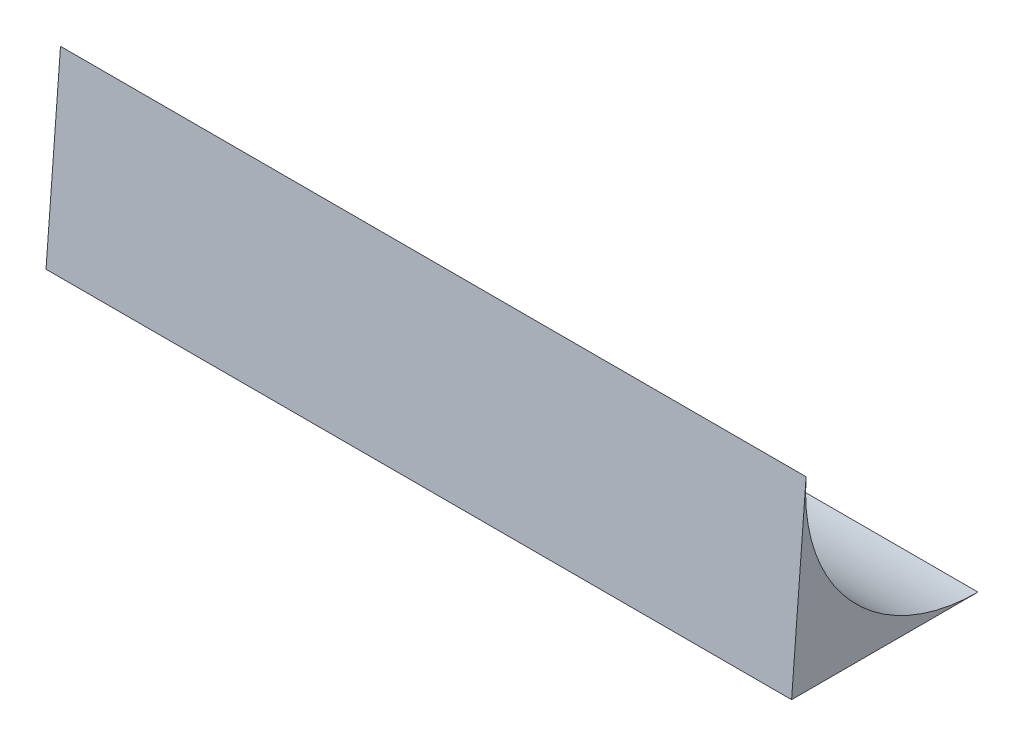
ISO-10303-21;
HEADER;
FILE_DESCRIPTION(('STEP AP214'),'2;1');
FILE_NAME('part.step','',(''),(''),'','','');
FILE_SCHEMA(('AUTOMOTIVE_DESIGN { 1 0 10303 214 1 1 1 1 }'));
ENDSEC;
DATA;
#1=APPLICATION_CONTEXT('core data for automotive mechanical design processes');
#2=APPLICATION_PROTOCOL_DEFINITION('international standard','automotive_design',2000,#1);
#3=PRODUCT_CONTEXT('',#1,'mechanical');
#4=PRODUCT('Part','Part','',(#3));
#5=PRODUCT_RELATED_PRODUCT_CATEGORY('part','',(#4));
#6=PRODUCT_DEFINITION_FORMATION('','',#4);
#7=PRODUCT_DEFINITION_CONTEXT('part definition',#1,'design');
#8=PRODUCT_DEFINITION('design','',#6,#7);
#9=PRODUCT_DEFINITION_SHAPE('','',#8);
#10=(LENGTH_UNIT() NAMED_UNIT(*) SI_UNIT(.MILLI.,.METRE.));
#11=(NAMED_UNIT(*) PLANE_ANGLE_UNIT() SI_UNIT($,.RADIAN.));
#12=(NAMED_UNIT(*) SI_UNIT($,.STERADIAN.) SOLID_ANGLE_UNIT());
#13=UNCERTAINTY_MEASURE_WITH_UNIT(LENGTH_MEASURE(1.E-05),#10,'distance_accuracy_value','');
#14=(GEOMETRIC_REPRESENTATION_CONTEXT(3) GLOBAL_UNCERTAINTY_ASSIGNED_CONTEXT((#13)) GLOBAL_UNIT_ASSIGNED_CONTEXT((#10,
#11,#12)) REPRESENTATION_CONTEXT('',''));
#15=CARTESIAN_POINT('',(0.,0.,0.));
#16=DIRECTION('',(0.,0.,1.));
#17=DIRECTION('',(1.,0.,0.));
#18=AXIS2_PLACEMENT_3D('',#15,#16,#17);
#19=CARTESIAN_POINT('',(40.,0.,0.));
#20=DIRECTION('',(0.,-0.0778039744021554,-0.996968676321994));
#21=DIRECTION('',(0.,0.996968676321994,-0.0778039744021554));
#22=AXIS2_PLACEMENT_3D('',#19,#20,#21);
#23=PLANE('',#22);
#24=DIRECTION('',(0.,-0.996968676321994,0.0778039744021554));
#25=VECTOR('',#24,1.);
#26=CARTESIAN_POINT('',(0.,0.,0.));
#27=LINE('',#26,#25);
#28=CARTESIAN_POINT('',(0.,9.96968676321994,-0.778039744021556));
#29=VERTEX_POINT('',#28);
#30=CARTESIAN_POINT('',(0.,0.,0.));
#31=VERTEX_POINT('',#30);
#32=EDGE_CURVE('E82',#29,#31,#27,.T.);
#33=ORIENTED_EDGE('',*,*,#32,.T.);
#34=DIRECTION('',(-1.,0.,0.));
#35=VECTOR('',#34,1.);
#36=CARTESIAN_POINT('',(40.,0.,0.));
#37=LINE('',#36,#35);
#38=CARTESIAN_POINT('',(40.,0.,0.));
#39=VERTEX_POINT('',#38);
#40=EDGE_CURVE('E11',#39,#31,#37,.T.);
#41=ORIENTED_EDGE('',*,*,#40,.F.);
#42=DIRECTION('',(0.,-0.996968676321994,0.0778039744021554));
#43=VECTOR('',#42,1.);
#44=CARTESIAN_POINT('',(40.,0.,0.));
#45=LINE('',#44,#43);
#46=CARTESIAN_POINT('',(40.,9.96968676321994,-0.778039744021556));
#47=VERTEX_POINT('',#46);
#48=EDGE_CURVE('E75',#47,#39,#45,.T.);
#49=ORIENTED_EDGE('',*,*,#48,.F.);
#50=DIRECTION('',(-1.,0.,0.));
#51=VECTOR('',#50,1.);
#52=CARTESIAN_POINT('',(40.,9.96968676321994,-0.778039744021556));
#53=LINE('',#52,#51);
#54=EDGE_CURVE('E83',#47,#29,#53,.T.);
#55=ORIENTED_EDGE('',*,*,#54,.T.);
#56=EDGE_LOOP('',(#33,#41,#49,#55));
#57=FACE_BOUND('',#56,.T.);
#58=ADVANCED_FACE('F35',(#57),#23,.F.);
#59=CARTESIAN_POINT('',(40.,0.,0.));
#60=DIRECTION('',(0.,1.,0.));
#61=DIRECTION('',(0.,0.,1.));
#62=AXIS2_PLACEMENT_3D('',#59,#60,#61);
#63=PLANE('',#62);
#64=DIRECTION('',(0.,0.,-1.));
#65=VECTOR('',#64,1.);
#66=CARTESIAN_POINT('',(0.,0.,0.));
#67=LINE('',#66,#65);
#68=CARTESIAN_POINT('',(0.,0.,-10.));
#69=VERTEX_POINT('',#68);
#70=EDGE_CURVE('E63',#31,#69,#67,.T.);
#71=ORIENTED_EDGE('',*,*,#70,.T.);
#72=DIRECTION('',(-1.,0.,0.));
#73=VECTOR('',#72,1.);
#74=CARTESIAN_POINT('',(40.,0.,-10.));
#75=LINE('',#74,#73);
#76=CARTESIAN_POINT('',(40.,0.,-10.));
#77=VERTEX_POINT('',#76);
#78=EDGE_CURVE('E43',#77,#69,#75,.T.);
#79=ORIENTED_EDGE('',*,*,#78,.F.);
#80=DIRECTION('',(0.,0.,-1.));
#81=VECTOR('',#80,1.);
#82=CARTESIAN_POINT('',(40.,0.,0.));
#83=LINE('',#82,#81);
#84=EDGE_CURVE('E71',#39,#77,#83,.T.);
#85=ORIENTED_EDGE('',*,*,#84,.F.);
#86=ORIENTED_EDGE('',*,*,#40,.T.);
#87=EDGE_LOOP('',(#71,#79,#85,#86));
#88=FACE_BOUND('',#87,.T.);
#89=ADVANCED_FACE('F72',(#88),#63,.F.);
#90=CARTESIAN_POINT('',(40.,9.25,-10.));
#91=DIRECTION('',(-1.,0.,0.));
#92=DIRECTION('',(0.,0.,1.));
#93=AXIS2_PLACEMENT_3D('',#90,#91,#92);
#94=CYLINDRICAL_SURFACE('',#93,9.25);
#95=CARTESIAN_POINT('',(0.,9.25,-10.));
#96=DIRECTION('',(-1.,0.,0.));
#97=DIRECTION('',(0.,0.,-1.));
#98=AXIS2_PLACEMENT_3D('',#95,#96,#97);
#99=CIRCLE('',#98,9.25);
#100=EDGE_CURVE('E68',#69,#29,#99,.T.);
#101=ORIENTED_EDGE('',*,*,#100,.T.);
#102=ORIENTED_EDGE('',*,*,#54,.F.);
#103=CARTESIAN_POINT('',(40.,9.25,-10.));
#104=DIRECTION('',(-1.,0.,0.));
#105=DIRECTION('',(0.,0.,-1.));
#106=AXIS2_PLACEMENT_3D('',#103,#104,#105);
#107=CIRCLE('',#106,9.25);
#108=EDGE_CURVE('E51',#77,#47,#107,.T.);
#109=ORIENTED_EDGE('',*,*,#108,.F.);
#110=ORIENTED_EDGE('',*,*,#78,.T.);
#111=EDGE_LOOP('',(#101,#102,#109,#110));
#112=FACE_BOUND('',#111,.T.);
#113=ADVANCED_FACE('F90',(#112),#94,.F.);
#114=CARTESIAN_POINT('',(40.,9.25,-10.));
#115=DIRECTION('',(1.,0.,0.));
#116=DIRECTION('',(0.,0.,-1.));
#117=AXIS2_PLACEMENT_3D('',#114,#115,#116);
#118=PLANE('',#117);
#119=ORIENTED_EDGE('',*,*,#48,.T.);
#120=ORIENTED_EDGE('',*,*,#84,.T.);
#121=ORIENTED_EDGE('',*,*,#108,.T.);
#122=EDGE_LOOP('',(#119,#120,#121));
#123=FACE_BOUND('',#122,.T.);
#124=ADVANCED_FACE('F78',(#123),#118,.T.);
#125=CARTESIAN_POINT('',(0.,9.25,-10.));
#126=DIRECTION('',(1.,0.,0.));
#127=DIRECTION('',(0.,0.,-1.));
#128=AXIS2_PLACEMENT_3D('',#125,#126,#127);
#129=PLANE('',#128);
#130=ORIENTED_EDGE('',*,*,#32,.F.);
#131=ORIENTED_EDGE('',*,*,#100,.F.);
#132=ORIENTED_EDGE('',*,*,#70,.F.);
#133=EDGE_LOOP('',(#130,#131,#132));
#134=FACE_BOUND('',#133,.T.);
#135=ADVANCED_FACE('F91',(#134),#129,.F.);
#136=CLOSED_SHELL('',(#58,#89,#113,#124,#135));
#137=MANIFOLD_SOLID_BREP('B2',#136);
#138=ADVANCED_BREP_SHAPE_REPRESENTATION('',(#18,#137),#14);
#139=SHAPE_DEFINITION_REPRESENTATION(#9,#138);
ENDSEC;
END-ISO-10303-21;
